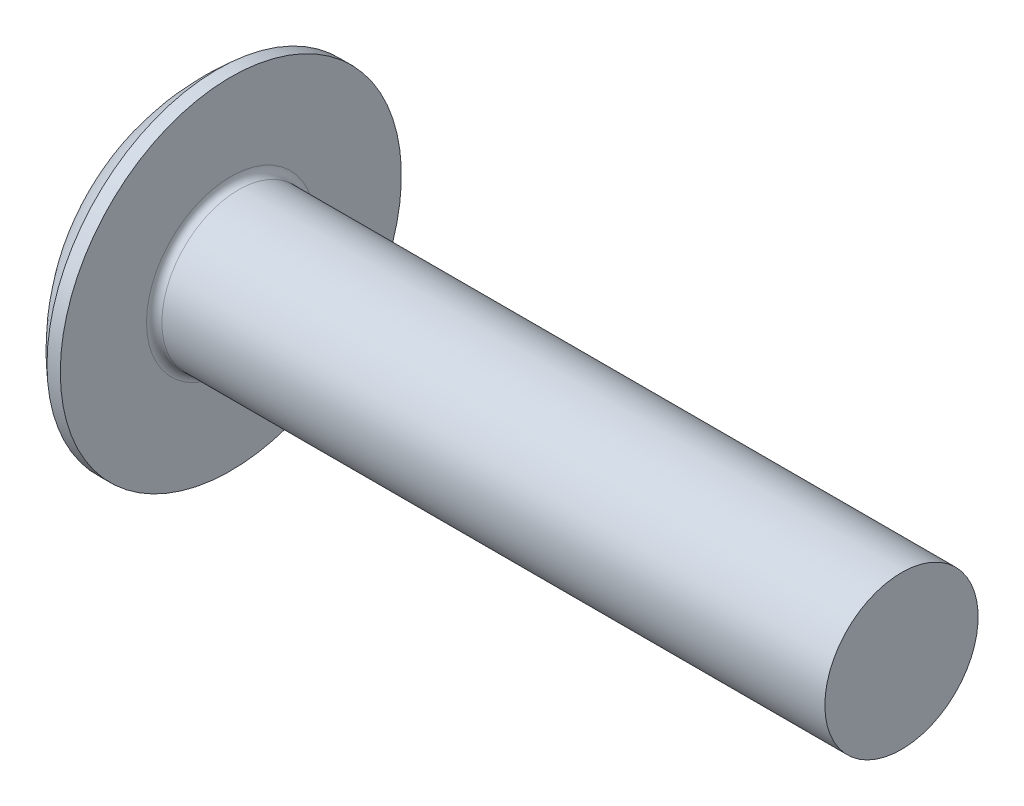
ISO-10303-21;
HEADER;
FILE_DESCRIPTION(('STEP AP214'),'2;1');
FILE_NAME('part.step','',(''),(''),'','','');
FILE_SCHEMA(('AUTOMOTIVE_DESIGN { 1 0 10303 214 1 1 1 1 }'));
ENDSEC;
DATA;
#1=APPLICATION_CONTEXT('core data for automotive mechanical design processes');
#2=APPLICATION_PROTOCOL_DEFINITION('international standard','automotive_design',2000,#1);
#3=PRODUCT_CONTEXT('',#1,'mechanical');
#4=PRODUCT('Part','Part','',(#3));
#5=PRODUCT_RELATED_PRODUCT_CATEGORY('part','',(#4));
#6=PRODUCT_DEFINITION_FORMATION('','',#4);
#7=PRODUCT_DEFINITION_CONTEXT('part definition',#1,'design');
#8=PRODUCT_DEFINITION('design','',#6,#7);
#9=PRODUCT_DEFINITION_SHAPE('','',#8);
#10=(LENGTH_UNIT() NAMED_UNIT(*) SI_UNIT(.MILLI.,.METRE.));
#11=(NAMED_UNIT(*) PLANE_ANGLE_UNIT() SI_UNIT($,.RADIAN.));
#12=(NAMED_UNIT(*) SI_UNIT($,.STERADIAN.) SOLID_ANGLE_UNIT());
#13=UNCERTAINTY_MEASURE_WITH_UNIT(LENGTH_MEASURE(1.E-05),#10,'distance_accuracy_value','');
#14=(GEOMETRIC_REPRESENTATION_CONTEXT(3) GLOBAL_UNCERTAINTY_ASSIGNED_CONTEXT((#13)) GLOBAL_UNIT_ASSIGNED_CONTEXT((#10,
#11,#12)) REPRESENTATION_CONTEXT('',''));
#15=CARTESIAN_POINT('',(0.,0.,0.));
#16=DIRECTION('',(0.,0.,1.));
#17=DIRECTION('',(1.,0.,0.));
#18=AXIS2_PLACEMENT_3D('',#15,#16,#17);
#19=CARTESIAN_POINT('',(11.7,0.,0.));
#20=DIRECTION('',(-1.,0.,0.));
#21=DIRECTION('',(0.,1.,0.));
#22=AXIS2_PLACEMENT_3D('',#19,#20,#21);
#23=SPHERICAL_SURFACE('',#22,11.7);
#24=CARTESIAN_POINT('',(4.10526498158099,0.,0.));
#25=DIRECTION('',(-1.,0.,0.));
#26=DIRECTION('',(0.,0.,1.));
#27=AXIS2_PLACEMENT_3D('',#24,#25,#26);
#28=CIRCLE('',#27,8.9);
#29=CARTESIAN_POINT('',(4.10526498158099,0.,8.9));
#30=VERTEX_POINT('',#29);
#31=EDGE_CURVE('E80',#30,#30,#28,.T.);
#32=ORIENTED_EDGE('',*,*,#31,.T.);
#33=EDGE_LOOP('',(#32));
#34=FACE_BOUND('',#33,.T.);
#35=CARTESIAN_POINT('',(11.7,-0.8,0.));
#36=DIRECTION('',(0.,1.,0.));
#37=DIRECTION('',(0.,0.,1.));
#38=AXIS2_PLACEMENT_3D('',#35,#36,#37);
#39=CIRCLE('',#38,11.6726175299288);
#40=CARTESIAN_POINT('',(2.4,-0.8,7.05407683541936));
#41=VERTEX_POINT('',#40);
#42=CARTESIAN_POINT('',(2.4,-0.8,-7.05407683541936));
#43=VERTEX_POINT('',#42);
#44=EDGE_CURVE('E38',#41,#43,#39,.F.);
#45=ORIENTED_EDGE('',*,*,#44,.T.);
#46=CARTESIAN_POINT('',(2.4,0.,0.));
#47=DIRECTION('',(-1.,0.,0.));
#48=DIRECTION('',(0.,0.,1.));
#49=AXIS2_PLACEMENT_3D('',#46,#47,#48);
#50=CIRCLE('',#49,7.09929573971954);
#51=CARTESIAN_POINT('',(2.4,0.8,-7.05407683541936));
#52=VERTEX_POINT('',#51);
#53=EDGE_CURVE('E11',#43,#52,#50,.F.);
#54=ORIENTED_EDGE('',*,*,#53,.T.);
#55=CARTESIAN_POINT('',(11.7,0.799999999999999,0.));
#56=DIRECTION('',(0.,-1.,0.));
#57=DIRECTION('',(0.,0.,-1.));
#58=AXIS2_PLACEMENT_3D('',#55,#56,#57);
#59=CIRCLE('',#58,11.6726175299288);
#60=CARTESIAN_POINT('',(2.4,0.799999999999998,7.05407683541936));
#61=VERTEX_POINT('',#60);
#62=EDGE_CURVE('E69',#52,#61,#59,.F.);
#63=ORIENTED_EDGE('',*,*,#62,.T.);
#64=EDGE_CURVE('E44',#61,#41,#50,.F.);
#65=ORIENTED_EDGE('',*,*,#64,.T.);
#66=EDGE_LOOP('',(#45,#54,#63,#65));
#67=FACE_BOUND('',#66,.T.);
#68=ADVANCED_FACE('F34',(#34,#67),#23,.T.);
#69=CARTESIAN_POINT('',(-25.4,0.,0.));
#70=DIRECTION('',(-1.,0.,0.));
#71=DIRECTION('',(0.,0.,1.));
#72=AXIS2_PLACEMENT_3D('',#69,#70,#71);
#73=CYLINDRICAL_SURFACE('',#72,4.);
#74=CARTESIAN_POINT('',(5.2,0.,0.));
#75=DIRECTION('',(-1.,0.,0.));
#76=DIRECTION('',(0.,0.,1.));
#77=AXIS2_PLACEMENT_3D('',#74,#75,#76);
#78=CIRCLE('',#77,4.);
#79=CARTESIAN_POINT('',(5.2,0.,4.));
#80=VERTEX_POINT('',#79);
#81=EDGE_CURVE('E70',#80,#80,#78,.F.);
#82=ORIENTED_EDGE('',*,*,#81,.T.);
#83=EDGE_LOOP('',(#82));
#84=FACE_BOUND('',#83,.T.);
#85=CARTESIAN_POINT('',(39.8,0.,0.));
#86=DIRECTION('',(-1.,0.,0.));
#87=DIRECTION('',(0.,0.,1.));
#88=AXIS2_PLACEMENT_3D('',#85,#86,#87);
#89=CIRCLE('',#88,4.);
#90=CARTESIAN_POINT('',(39.8,0.,4.));
#91=VERTEX_POINT('',#90);
#92=EDGE_CURVE('E77',#91,#91,#89,.T.);
#93=ORIENTED_EDGE('',*,*,#92,.T.);
#94=EDGE_LOOP('',(#93));
#95=FACE_BOUND('',#94,.T.);
#96=ADVANCED_FACE('F97',(#84,#95),#73,.T.);
#97=CARTESIAN_POINT('',(39.8,4.,0.));
#98=DIRECTION('',(1.,0.,0.));
#99=DIRECTION('',(0.,0.,-1.));
#100=AXIS2_PLACEMENT_3D('',#97,#98,#99);
#101=PLANE('',#100);
#102=ORIENTED_EDGE('',*,*,#92,.F.);
#103=EDGE_LOOP('',(#102));
#104=FACE_BOUND('',#103,.T.);
#105=ADVANCED_FACE('F103',(#104),#101,.T.);
#106=CARTESIAN_POINT('',(-25.4,0.,0.));
#107=DIRECTION('',(-1.,0.,0.));
#108=DIRECTION('',(0.,0.,1.));
#109=AXIS2_PLACEMENT_3D('',#106,#107,#108);
#110=CYLINDRICAL_SURFACE('',#109,8.9);
#111=ORIENTED_EDGE('',*,*,#31,.F.);
#112=EDGE_LOOP('',(#111));
#113=FACE_BOUND('',#112,.T.);
#114=CARTESIAN_POINT('',(4.8,0.,0.));
#115=DIRECTION('',(-1.,0.,0.));
#116=DIRECTION('',(0.,0.,1.));
#117=AXIS2_PLACEMENT_3D('',#114,#115,#116);
#118=CIRCLE('',#117,8.9);
#119=CARTESIAN_POINT('',(4.8,0.,8.9));
#120=VERTEX_POINT('',#119);
#121=EDGE_CURVE('E83',#120,#120,#118,.T.);
#122=ORIENTED_EDGE('',*,*,#121,.T.);
#123=EDGE_LOOP('',(#122));
#124=FACE_BOUND('',#123,.T.);
#125=ADVANCED_FACE('F107',(#113,#124),#110,.T.);
#126=CARTESIAN_POINT('',(4.8,4.,0.));
#127=DIRECTION('',(-1.,0.,0.));
#128=DIRECTION('',(0.,0.,1.));
#129=AXIS2_PLACEMENT_3D('',#126,#127,#128);
#130=PLANE('',#129);
#131=CARTESIAN_POINT('',(4.8,0.,0.));
#132=DIRECTION('',(-1.,0.,0.));
#133=DIRECTION('',(0.,0.,1.));
#134=AXIS2_PLACEMENT_3D('',#131,#132,#133);
#135=CIRCLE('',#134,4.4);
#136=CARTESIAN_POINT('',(4.8,0.,4.4));
#137=VERTEX_POINT('',#136);
#138=EDGE_CURVE('E74',#137,#137,#135,.T.);
#139=ORIENTED_EDGE('',*,*,#138,.T.);
#140=EDGE_LOOP('',(#139));
#141=FACE_BOUND('',#140,.T.);
#142=ORIENTED_EDGE('',*,*,#121,.F.);
#143=EDGE_LOOP('',(#142));
#144=FACE_BOUND('',#143,.T.);
#145=ADVANCED_FACE('F114',(#141,#144),#130,.F.);
#146=CARTESIAN_POINT('',(5.2,0.,0.));
#147=DIRECTION('',(-1.,0.,0.));
#148=DIRECTION('',(0.,0.,1.));
#149=AXIS2_PLACEMENT_3D('',#146,#147,#148);
#150=TOROIDAL_SURFACE('',#149,4.4,0.4);
#151=ORIENTED_EDGE('',*,*,#81,.F.);
#152=EDGE_LOOP('',(#151));
#153=FACE_BOUND('',#152,.T.);
#154=ORIENTED_EDGE('',*,*,#138,.F.);
#155=EDGE_LOOP('',(#154));
#156=FACE_BOUND('',#155,.T.);
#157=ADVANCED_FACE('F36',(#153,#156),#150,.F.);
#158=CARTESIAN_POINT('',(2.4,-0.8,8.9));
#159=DIRECTION('',(0.,1.,0.));
#160=DIRECTION('',(0.,0.,1.));
#161=AXIS2_PLACEMENT_3D('',#158,#159,#160);
#162=PLANE('',#161);
#163=DIRECTION('',(0.,0.,-1.));
#164=VECTOR('',#163,1.);
#165=CARTESIAN_POINT('',(2.4,-0.8,8.9));
#166=LINE('',#165,#164);
#167=EDGE_CURVE('E51',#41,#43,#166,.T.);
#168=ORIENTED_EDGE('',*,*,#167,.T.);
#169=ORIENTED_EDGE('',*,*,#44,.F.);
#170=EDGE_LOOP('',(#168,#169));
#171=FACE_BOUND('',#170,.T.);
#172=ADVANCED_FACE('F67',(#171),#162,.T.);
#173=CARTESIAN_POINT('',(2.4,0.8,-8.9));
#174=DIRECTION('',(0.,-1.,0.));
#175=DIRECTION('',(0.,0.,-1.));
#176=AXIS2_PLACEMENT_3D('',#173,#174,#175);
#177=PLANE('',#176);
#178=DIRECTION('',(0.,0.,1.));
#179=VECTOR('',#178,1.);
#180=CARTESIAN_POINT('',(2.4,0.8,-8.9));
#181=LINE('',#180,#179);
#182=EDGE_CURVE('E62',#52,#61,#181,.T.);
#183=ORIENTED_EDGE('',*,*,#182,.T.);
#184=ORIENTED_EDGE('',*,*,#62,.F.);
#185=EDGE_LOOP('',(#183,#184));
#186=FACE_BOUND('',#185,.T.);
#187=ADVANCED_FACE('F87',(#186),#177,.T.);
#188=CARTESIAN_POINT('',(2.4,-0.8,8.9));
#189=DIRECTION('',(-1.,0.,0.));
#190=DIRECTION('',(0.,0.,1.));
#191=AXIS2_PLACEMENT_3D('',#188,#189,#190);
#192=PLANE('',#191);
#193=ORIENTED_EDGE('',*,*,#167,.F.);
#194=ORIENTED_EDGE('',*,*,#64,.F.);
#195=ORIENTED_EDGE('',*,*,#182,.F.);
#196=ORIENTED_EDGE('',*,*,#53,.F.);
#197=EDGE_LOOP('',(#193,#194,#195,#196));
#198=FACE_BOUND('',#197,.T.);
#199=ADVANCED_FACE('F61',(#198),#192,.T.);
#200=CLOSED_SHELL('',(#68,#96,#105,#125,#145,#157,#172,#187,#199));
#201=MANIFOLD_SOLID_BREP('B2',#200);
#202=ADVANCED_BREP_SHAPE_REPRESENTATION('',(#18,#201),#14);
#203=SHAPE_DEFINITION_REPRESENTATION(#9,#202);
ENDSEC;
END-ISO-10303-21;
